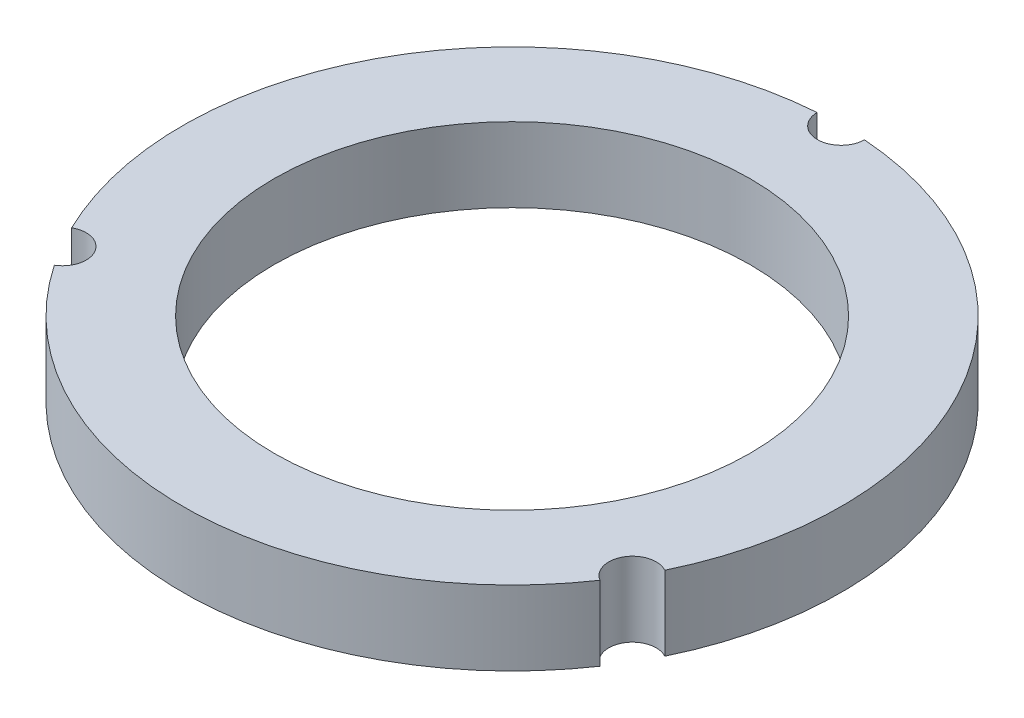
ISO-10303-21;
HEADER;
FILE_DESCRIPTION(('STEP AP214'),'2;1');
FILE_NAME('part.step','',(''),(''),'','','');
FILE_SCHEMA(('AUTOMOTIVE_DESIGN { 1 0 10303 214 1 1 1 1 }'));
ENDSEC;
DATA;
#1=APPLICATION_CONTEXT('core data for automotive mechanical design processes');
#2=APPLICATION_PROTOCOL_DEFINITION('international standard','automotive_design',2000,#1);
#3=PRODUCT_CONTEXT('',#1,'mechanical');
#4=PRODUCT('Part','Part','',(#3));
#5=PRODUCT_RELATED_PRODUCT_CATEGORY('part','',(#4));
#6=PRODUCT_DEFINITION_FORMATION('','',#4);
#7=PRODUCT_DEFINITION_CONTEXT('part definition',#1,'design');
#8=PRODUCT_DEFINITION('design','',#6,#7);
#9=PRODUCT_DEFINITION_SHAPE('','',#8);
#10=(LENGTH_UNIT() NAMED_UNIT(*) SI_UNIT(.MILLI.,.METRE.));
#11=(NAMED_UNIT(*) PLANE_ANGLE_UNIT() SI_UNIT($,.RADIAN.));
#12=(NAMED_UNIT(*) SI_UNIT($,.STERADIAN.) SOLID_ANGLE_UNIT());
#13=UNCERTAINTY_MEASURE_WITH_UNIT(LENGTH_MEASURE(1.E-05),#10,'distance_accuracy_value','');
#14=(GEOMETRIC_REPRESENTATION_CONTEXT(3) GLOBAL_UNCERTAINTY_ASSIGNED_CONTEXT((#13)) GLOBAL_UNIT_ASSIGNED_CONTEXT((#10,
#11,#12)) REPRESENTATION_CONTEXT('',''));
#15=CARTESIAN_POINT('',(0.,0.,0.));
#16=DIRECTION('',(0.,0.,1.));
#17=DIRECTION('',(1.,0.,0.));
#18=AXIS2_PLACEMENT_3D('',#15,#16,#17);
#19=CARTESIAN_POINT('',(0.,2.26,0.));
#20=DIRECTION('',(0.,-1.,0.));
#21=DIRECTION('',(0.,0.,-1.));
#22=AXIS2_PLACEMENT_3D('',#19,#20,#21);
#23=CYLINDRICAL_SURFACE('',#22,10.);
#24=CARTESIAN_POINT('',(0.,0.,0.));
#25=DIRECTION('',(0.,1.,0.));
#26=DIRECTION('',(0.,0.,1.));
#27=AXIS2_PLACEMENT_3D('',#24,#25,#26);
#28=CIRCLE('',#27,10.);
#29=CARTESIAN_POINT('',(-8.27783672601638,0.,5.61047405638902));
#30=VERTEX_POINT('',#29);
#31=CARTESIAN_POINT('',(8.27783672601725,0.,5.61047405638775));
#32=VERTEX_POINT('',#31);
#33=EDGE_CURVE('E117',#30,#32,#28,.T.);
#34=ORIENTED_EDGE('',*,*,#33,.T.);
#35=DIRECTION('',(0.,1.,0.));
#36=VECTOR('',#35,1.);
#37=CARTESIAN_POINT('',(8.27783672601725,1.13,5.61047405638775));
#38=LINE('',#37,#36);
#39=CARTESIAN_POINT('',(8.27783672601725,2.26,5.61047405638775));
#40=VERTEX_POINT('',#39);
#41=EDGE_CURVE('E11',#32,#40,#38,.T.);
#42=ORIENTED_EDGE('',*,*,#41,.T.);
#43=CARTESIAN_POINT('',(0.,2.26,0.));
#44=DIRECTION('',(0.,1.,0.));
#45=DIRECTION('',(0.,0.,1.));
#46=AXIS2_PLACEMENT_3D('',#43,#44,#45);
#47=CIRCLE('',#46,10.);
#48=CARTESIAN_POINT('',(-8.27783672601638,2.26,5.61047405638902));
#49=VERTEX_POINT('',#48);
#50=EDGE_CURVE('E107',#49,#40,#47,.T.);
#51=ORIENTED_EDGE('',*,*,#50,.F.);
#52=DIRECTION('',(0.,1.,0.));
#53=VECTOR('',#52,1.);
#54=CARTESIAN_POINT('',(-8.27783672601639,1.13,5.61047405638902));
#55=LINE('',#54,#53);
#56=EDGE_CURVE('E89',#49,#30,#55,.F.);
#57=ORIENTED_EDGE('',*,*,#56,.T.);
#58=EDGE_LOOP('',(#34,#42,#51,#57));
#59=FACE_BOUND('',#58,.T.);
#60=ADVANCED_FACE('F39',(#59),#23,.T.);
#61=CARTESIAN_POINT('',(8.9977314231145,2.26,4.36357986491572));
#62=VERTEX_POINT('',#61);
#63=CARTESIAN_POINT('',(0.719894697096796,2.26,-9.97405392130461));
#64=VERTEX_POINT('',#63);
#65=EDGE_CURVE('E99',#62,#64,#47,.T.);
#66=ORIENTED_EDGE('',*,*,#65,.F.);
#67=DIRECTION('',(0.,1.,0.));
#68=VECTOR('',#67,1.);
#69=CARTESIAN_POINT('',(8.9977314231145,1.13,4.36357986491572));
#70=LINE('',#69,#68);
#71=CARTESIAN_POINT('',(8.9977314231145,0.,4.36357986491572));
#72=VERTEX_POINT('',#71);
#73=EDGE_CURVE('E47',#62,#72,#70,.F.);
#74=ORIENTED_EDGE('',*,*,#73,.T.);
#75=CARTESIAN_POINT('',(0.719894697096796,0.,-9.97405392130461));
#76=VERTEX_POINT('',#75);
#77=EDGE_CURVE('E112',#72,#76,#28,.T.);
#78=ORIENTED_EDGE('',*,*,#77,.T.);
#79=DIRECTION('',(0.,1.,0.));
#80=VECTOR('',#79,1.);
#81=CARTESIAN_POINT('',(0.719894697096796,1.13,-9.97405392130461));
#82=LINE('',#81,#80);
#83=EDGE_CURVE('E128',#76,#64,#82,.T.);
#84=ORIENTED_EDGE('',*,*,#83,.T.);
#85=EDGE_LOOP('',(#66,#74,#78,#84));
#86=FACE_BOUND('',#85,.T.);
#87=ADVANCED_FACE('F126',(#86),#23,.T.);
#88=CARTESIAN_POINT('',(0.,2.26,0.));
#89=DIRECTION('',(0.,1.,0.));
#90=DIRECTION('',(0.,0.,1.));
#91=AXIS2_PLACEMENT_3D('',#88,#89,#90);
#92=PLANE('',#91);
#93=CARTESIAN_POINT('',(8.64844797717901,2.26,4.99318376769604));
#94=DIRECTION('',(0.,1.,0.));
#95=DIRECTION('',(0.,0.,1.));
#96=AXIS2_PLACEMENT_3D('',#93,#94,#95);
#97=CIRCLE('',#96,0.720000000000546);
#98=EDGE_CURVE('E122',#62,#40,#97,.T.);
#99=ORIENTED_EDGE('',*,*,#98,.F.);
#100=ORIENTED_EDGE('',*,*,#65,.T.);
#101=CARTESIAN_POINT('',(0.,2.26,-9.98636753539282));
#102=DIRECTION('',(0.,1.,0.));
#103=DIRECTION('',(0.,0.,1.));
#104=AXIS2_PLACEMENT_3D('',#101,#102,#103);
#105=CIRCLE('',#104,0.72);
#106=CARTESIAN_POINT('',(-0.719894697096796,2.26,-9.97405392130461));
#107=VERTEX_POINT('',#106);
#108=EDGE_CURVE('E121',#107,#64,#105,.T.);
#109=ORIENTED_EDGE('',*,*,#108,.F.);
#110=CARTESIAN_POINT('',(-8.99773142311406,2.26,4.36357986491662));
#111=VERTEX_POINT('',#110);
#112=EDGE_CURVE('E110',#107,#111,#47,.T.);
#113=ORIENTED_EDGE('',*,*,#112,.T.);
#114=CARTESIAN_POINT('',(-8.64844797717774,2.26,4.99318376769677));
#115=DIRECTION('',(0.,1.,0.));
#116=DIRECTION('',(0.,0.,1.));
#117=AXIS2_PLACEMENT_3D('',#114,#115,#116);
#118=CIRCLE('',#117,0.720000000000797);
#119=EDGE_CURVE('E92',#49,#111,#118,.T.);
#120=ORIENTED_EDGE('',*,*,#119,.F.);
#121=ORIENTED_EDGE('',*,*,#50,.T.);
#122=EDGE_LOOP('',(#99,#100,#109,#113,#120,#121));
#123=FACE_BOUND('',#122,.T.);
#124=CARTESIAN_POINT('',(0.,2.26,0.));
#125=DIRECTION('',(0.,1.,0.));
#126=DIRECTION('',(0.,0.,1.));
#127=AXIS2_PLACEMENT_3D('',#124,#125,#126);
#128=CIRCLE('',#127,7.22);
#129=CARTESIAN_POINT('',(0.,2.26,7.22));
#130=VERTEX_POINT('',#129);
#131=EDGE_CURVE('E133',#130,#130,#128,.T.);
#132=ORIENTED_EDGE('',*,*,#131,.F.);
#133=EDGE_LOOP('',(#132));
#134=FACE_BOUND('',#133,.T.);
#135=ADVANCED_FACE('F105',(#123,#134),#92,.T.);
#136=CARTESIAN_POINT('',(0.,0.,0.));
#137=DIRECTION('',(0.,1.,0.));
#138=DIRECTION('',(0.,0.,1.));
#139=AXIS2_PLACEMENT_3D('',#136,#137,#138);
#140=PLANE('',#139);
#141=ORIENTED_EDGE('',*,*,#77,.F.);
#142=CARTESIAN_POINT('',(8.64844797717901,0.,4.99318376769604));
#143=DIRECTION('',(0.,1.,0.));
#144=DIRECTION('',(0.,0.,1.));
#145=AXIS2_PLACEMENT_3D('',#142,#143,#144);
#146=CIRCLE('',#145,0.720000000000546);
#147=EDGE_CURVE('E141',#72,#32,#146,.T.);
#148=ORIENTED_EDGE('',*,*,#147,.T.);
#149=ORIENTED_EDGE('',*,*,#33,.F.);
#150=CARTESIAN_POINT('',(-8.64844797717774,0.,4.99318376769677));
#151=DIRECTION('',(0.,1.,0.));
#152=DIRECTION('',(0.,0.,1.));
#153=AXIS2_PLACEMENT_3D('',#150,#151,#152);
#154=CIRCLE('',#153,0.720000000000797);
#155=CARTESIAN_POINT('',(-8.99773142311406,0.,4.36357986491662));
#156=VERTEX_POINT('',#155);
#157=EDGE_CURVE('E54',#30,#156,#154,.T.);
#158=ORIENTED_EDGE('',*,*,#157,.T.);
#159=CARTESIAN_POINT('',(-0.719894697096796,0.,-9.97405392130461));
#160=VERTEX_POINT('',#159);
#161=EDGE_CURVE('E115',#160,#156,#28,.T.);
#162=ORIENTED_EDGE('',*,*,#161,.F.);
#163=CARTESIAN_POINT('',(0.,0.,-9.98636753539282));
#164=DIRECTION('',(0.,1.,0.));
#165=DIRECTION('',(0.,0.,1.));
#166=AXIS2_PLACEMENT_3D('',#163,#164,#165);
#167=CIRCLE('',#166,0.72);
#168=EDGE_CURVE('E62',#160,#76,#167,.T.);
#169=ORIENTED_EDGE('',*,*,#168,.T.);
#170=EDGE_LOOP('',(#141,#148,#149,#158,#162,#169));
#171=FACE_BOUND('',#170,.T.);
#172=CARTESIAN_POINT('',(0.,0.,0.));
#173=DIRECTION('',(0.,1.,0.));
#174=DIRECTION('',(0.,0.,1.));
#175=AXIS2_PLACEMENT_3D('',#172,#173,#174);
#176=CIRCLE('',#175,7.22);
#177=CARTESIAN_POINT('',(0.,0.,7.22));
#178=VERTEX_POINT('',#177);
#179=EDGE_CURVE('E136',#178,#178,#176,.T.);
#180=ORIENTED_EDGE('',*,*,#179,.T.);
#181=EDGE_LOOP('',(#180));
#182=FACE_BOUND('',#181,.T.);
#183=ADVANCED_FACE('F149',(#171,#182),#140,.F.);
#184=ORIENTED_EDGE('',*,*,#112,.F.);
#185=DIRECTION('',(0.,1.,0.));
#186=VECTOR('',#185,1.);
#187=CARTESIAN_POINT('',(-0.719894697096796,1.13,-9.97405392130461));
#188=LINE('',#187,#186);
#189=EDGE_CURVE('E129',#107,#160,#188,.F.);
#190=ORIENTED_EDGE('',*,*,#189,.T.);
#191=ORIENTED_EDGE('',*,*,#161,.T.);
#192=DIRECTION('',(0.,1.,0.));
#193=VECTOR('',#192,1.);
#194=CARTESIAN_POINT('',(-8.99773142311406,1.13,4.36357986491662));
#195=LINE('',#194,#193);
#196=EDGE_CURVE('E98',#156,#111,#195,.T.);
#197=ORIENTED_EDGE('',*,*,#196,.T.);
#198=EDGE_LOOP('',(#184,#190,#191,#197));
#199=FACE_BOUND('',#198,.T.);
#200=ADVANCED_FACE('F41',(#199),#23,.T.);
#201=CARTESIAN_POINT('',(0.,2.26,0.));
#202=DIRECTION('',(0.,-1.,0.));
#203=DIRECTION('',(0.,0.,-1.));
#204=AXIS2_PLACEMENT_3D('',#201,#202,#203);
#205=CYLINDRICAL_SURFACE('',#204,7.22);
#206=ORIENTED_EDGE('',*,*,#131,.T.);
#207=EDGE_LOOP('',(#206));
#208=FACE_BOUND('',#207,.T.);
#209=ORIENTED_EDGE('',*,*,#179,.F.);
#210=EDGE_LOOP('',(#209));
#211=FACE_BOUND('',#210,.T.);
#212=ADVANCED_FACE('F166',(#208,#211),#205,.F.);
#213=CARTESIAN_POINT('',(-8.64844797717774,0.,4.99318376769677));
#214=DIRECTION('',(0.,1.,0.));
#215=DIRECTION('',(0.,0.,1.));
#216=AXIS2_PLACEMENT_3D('',#213,#214,#215);
#217=CYLINDRICAL_SURFACE('',#216,0.720000000000797);
#218=ORIENTED_EDGE('',*,*,#157,.F.);
#219=ORIENTED_EDGE('',*,*,#56,.F.);
#220=ORIENTED_EDGE('',*,*,#119,.T.);
#221=ORIENTED_EDGE('',*,*,#196,.F.);
#222=EDGE_LOOP('',(#218,#219,#220,#221));
#223=FACE_BOUND('',#222,.T.);
#224=ADVANCED_FACE('F91',(#223),#217,.F.);
#225=CARTESIAN_POINT('',(0.,0.,-9.98636753539282));
#226=DIRECTION('',(0.,1.,0.));
#227=DIRECTION('',(0.,0.,1.));
#228=AXIS2_PLACEMENT_3D('',#225,#226,#227);
#229=CYLINDRICAL_SURFACE('',#228,0.72);
#230=ORIENTED_EDGE('',*,*,#168,.F.);
#231=ORIENTED_EDGE('',*,*,#189,.F.);
#232=ORIENTED_EDGE('',*,*,#108,.T.);
#233=ORIENTED_EDGE('',*,*,#83,.F.);
#234=EDGE_LOOP('',(#230,#231,#232,#233));
#235=FACE_BOUND('',#234,.T.);
#236=ADVANCED_FACE('F154',(#235),#229,.F.);
#237=CARTESIAN_POINT('',(8.64844797717901,0.,4.99318376769604));
#238=DIRECTION('',(0.,1.,0.));
#239=DIRECTION('',(0.,0.,1.));
#240=AXIS2_PLACEMENT_3D('',#237,#238,#239);
#241=CYLINDRICAL_SURFACE('',#240,0.720000000000546);
#242=ORIENTED_EDGE('',*,*,#147,.F.);
#243=ORIENTED_EDGE('',*,*,#73,.F.);
#244=ORIENTED_EDGE('',*,*,#98,.T.);
#245=ORIENTED_EDGE('',*,*,#41,.F.);
#246=EDGE_LOOP('',(#242,#243,#244,#245));
#247=FACE_BOUND('',#246,.T.);
#248=ADVANCED_FACE('F152',(#247),#241,.F.);
#249=CLOSED_SHELL('',(#60,#87,#135,#183,#200,#212,#224,#236,#248));
#250=MANIFOLD_SOLID_BREP('B2',#249);
#251=ADVANCED_BREP_SHAPE_REPRESENTATION('',(#18,#250),#14);
#252=SHAPE_DEFINITION_REPRESENTATION(#9,#251);
ENDSEC;
END-ISO-10303-21;
